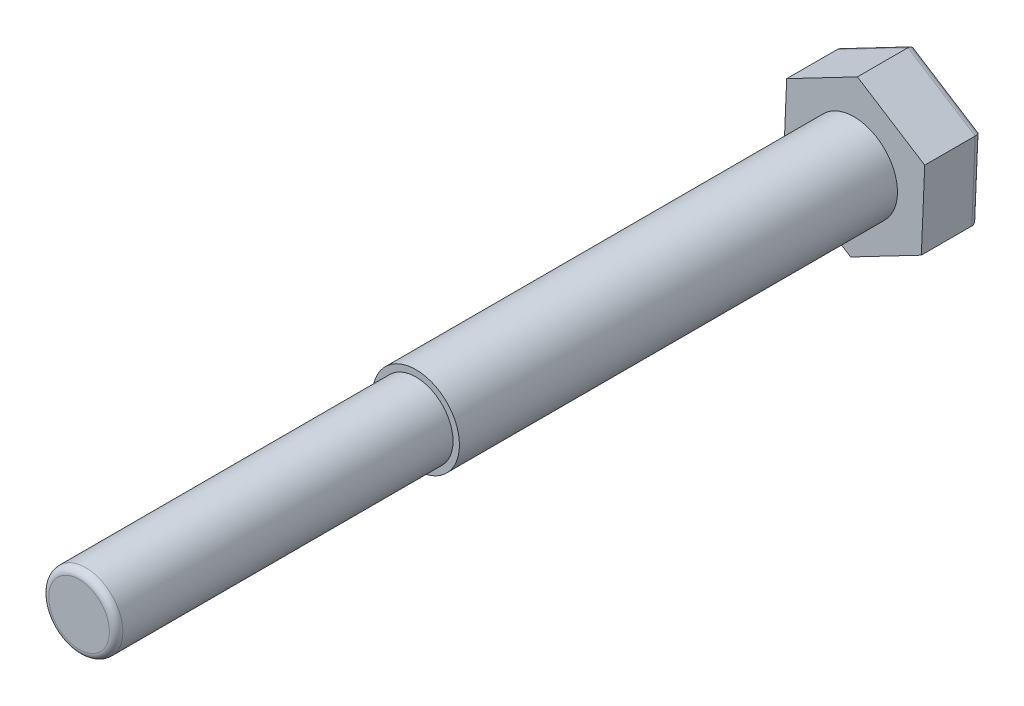
ISO-10303-21;
HEADER;
FILE_DESCRIPTION(('STEP AP214'),'2;1');
FILE_NAME('part.step','',(''),(''),'','','');
FILE_SCHEMA(('AUTOMOTIVE_DESIGN { 1 0 10303 214 1 1 1 1 }'));
ENDSEC;
DATA;
#1=APPLICATION_CONTEXT('core data for automotive mechanical design processes');
#2=APPLICATION_PROTOCOL_DEFINITION('international standard','automotive_design',2000,#1);
#3=PRODUCT_CONTEXT('',#1,'mechanical');
#4=PRODUCT('Part','Part','',(#3));
#5=PRODUCT_RELATED_PRODUCT_CATEGORY('part','',(#4));
#6=PRODUCT_DEFINITION_FORMATION('','',#4);
#7=PRODUCT_DEFINITION_CONTEXT('part definition',#1,'design');
#8=PRODUCT_DEFINITION('design','',#6,#7);
#9=PRODUCT_DEFINITION_SHAPE('','',#8);
#10=(LENGTH_UNIT() NAMED_UNIT(*) SI_UNIT(.MILLI.,.METRE.));
#11=(NAMED_UNIT(*) PLANE_ANGLE_UNIT() SI_UNIT($,.RADIAN.));
#12=(NAMED_UNIT(*) SI_UNIT($,.STERADIAN.) SOLID_ANGLE_UNIT());
#13=UNCERTAINTY_MEASURE_WITH_UNIT(LENGTH_MEASURE(1.E-05),#10,'distance_accuracy_value','');
#14=(GEOMETRIC_REPRESENTATION_CONTEXT(3) GLOBAL_UNCERTAINTY_ASSIGNED_CONTEXT((#13)) GLOBAL_UNIT_ASSIGNED_CONTEXT((#10,
#11,#12)) REPRESENTATION_CONTEXT('',''));
#15=CARTESIAN_POINT('',(0.,0.,0.));
#16=DIRECTION('',(0.,0.,1.));
#17=DIRECTION('',(1.,0.,0.));
#18=AXIS2_PLACEMENT_3D('',#15,#16,#17);
#19=CARTESIAN_POINT('',(0.,0.,147.));
#20=DIRECTION('',(0.,0.,1.));
#21=DIRECTION('',(1.,0.,0.));
#22=AXIS2_PLACEMENT_3D('',#19,#20,#21);
#23=PLANE('',#22);
#24=CARTESIAN_POINT('',(0.,0.,147.));
#25=DIRECTION('',(0.,0.,1.));
#26=DIRECTION('',(1.,0.,0.));
#27=AXIS2_PLACEMENT_3D('',#24,#25,#26);
#28=CIRCLE('',#27,12.9);
#29=CARTESIAN_POINT('',(12.9,0.,147.));
#30=VERTEX_POINT('',#29);
#31=EDGE_CURVE('E130',#30,#30,#28,.T.);
#32=ORIENTED_EDGE('',*,*,#31,.T.);
#33=EDGE_LOOP('',(#32));
#34=FACE_BOUND('',#33,.T.);
#35=CARTESIAN_POINT('',(0.,0.,147.));
#36=DIRECTION('',(0.,0.,1.));
#37=DIRECTION('',(1.,0.,0.));
#38=AXIS2_PLACEMENT_3D('',#35,#36,#37);
#39=CIRCLE('',#38,11.);
#40=CARTESIAN_POINT('',(11.,0.,147.));
#41=VERTEX_POINT('',#40);
#42=EDGE_CURVE('E168',#41,#41,#39,.T.);
#43=ORIENTED_EDGE('',*,*,#42,.F.);
#44=EDGE_LOOP('',(#43));
#45=FACE_BOUND('',#44,.T.);
#46=ADVANCED_FACE('F36',(#34,#45),#23,.T.);
#47=CARTESIAN_POINT('',(18.9733976863162,-36.3457037383633,17.));
#48=DIRECTION('',(0.,0.,-1.));
#49=DIRECTION('',(-1.,0.,0.));
#50=AXIS2_PLACEMENT_3D('',#47,#48,#49);
#51=PLANE('',#50);
#52=DIRECTION('',(0.0424733530909036,0.999097599975706,0.));
#53=VECTOR('',#52,1.);
#54=CARTESIAN_POINT('',(19.9787997617734,-12.6957037383635,17.));
#55=LINE('',#54,#53);
#56=CARTESIAN_POINT('',(19.9787997617734,-12.6957037383635,17.));
#57=VERTEX_POINT('',#56);
#58=CARTESIAN_POINT('',(20.9842018372306,10.9542962616365,17.));
#59=VERTEX_POINT('',#58);
#60=EDGE_CURVE('E122',#57,#59,#55,.T.);
#61=ORIENTED_EDGE('',*,*,#60,.T.);
#62=DIRECTION('',(-0.844007225893572,0.536331802748482,0.));
#63=VECTOR('',#62,1.);
#64=CARTESIAN_POINT('',(20.9842018372306,10.9542962616365,17.));
#65=LINE('',#64,#63);
#66=CARTESIAN_POINT('',(1.0054020754572,23.65,17.));
#67=VERTEX_POINT('',#66);
#68=EDGE_CURVE('E110',#59,#67,#65,.T.);
#69=ORIENTED_EDGE('',*,*,#68,.T.);
#70=DIRECTION('',(-0.886480578984472,-0.462765797227231,0.));
#71=VECTOR('',#70,1.);
#72=CARTESIAN_POINT('',(1.0054020754572,23.65,17.));
#73=LINE('',#72,#71);
#74=CARTESIAN_POINT('',(-19.9787997617736,12.6957037383632,17.));
#75=VERTEX_POINT('',#74);
#76=EDGE_CURVE('E121',#67,#75,#73,.T.);
#77=ORIENTED_EDGE('',*,*,#76,.T.);
#78=DIRECTION('',(-0.0424733530908878,-0.999097599975706,0.));
#79=VECTOR('',#78,1.);
#80=CARTESIAN_POINT('',(-19.9787997617736,12.6957037383632,17.));
#81=LINE('',#80,#79);
#82=CARTESIAN_POINT('',(-20.9842018372304,-10.9542962616368,17.));
#83=VERTEX_POINT('',#82);
#84=EDGE_CURVE('E272',#75,#83,#81,.T.);
#85=ORIENTED_EDGE('',*,*,#84,.T.);
#86=DIRECTION('',(0.844007225893576,-0.536331802748476,0.));
#87=VECTOR('',#86,1.);
#88=CARTESIAN_POINT('',(-20.9842018372304,-10.9542962616368,17.));
#89=LINE('',#88,#87);
#90=CARTESIAN_POINT('',(-1.00540207545719,-23.65,17.));
#91=VERTEX_POINT('',#90);
#92=EDGE_CURVE('E274',#83,#91,#89,.T.);
#93=ORIENTED_EDGE('',*,*,#92,.T.);
#94=DIRECTION('',(0.886480578984476,0.462765797227224,0.));
#95=VECTOR('',#94,1.);
#96=CARTESIAN_POINT('',(-1.00540207545719,-23.65,17.));
#97=LINE('',#96,#95);
#98=EDGE_CURVE('E128',#91,#57,#97,.T.);
#99=ORIENTED_EDGE('',*,*,#98,.T.);
#100=EDGE_LOOP('',(#61,#69,#77,#85,#93,#99));
#101=FACE_BOUND('',#100,.T.);
#102=CARTESIAN_POINT('',(0.,0.,17.));
#103=DIRECTION('',(0.,0.,-1.));
#104=DIRECTION('',(-1.,0.,0.));
#105=AXIS2_PLACEMENT_3D('',#102,#103,#104);
#106=CIRCLE('',#105,12.9);
#107=CARTESIAN_POINT('',(-12.9,0.,17.));
#108=VERTEX_POINT('',#107);
#109=EDGE_CURVE('E135',#108,#108,#106,.F.);
#110=ORIENTED_EDGE('',*,*,#109,.F.);
#111=EDGE_LOOP('',(#110));
#112=FACE_BOUND('',#111,.T.);
#113=ADVANCED_FACE('F125',(#101,#112),#51,.F.);
#114=CARTESIAN_POINT('',(19.9787997617734,-12.6957037383635,17.));
#115=DIRECTION('',(-0.999097599975706,0.0424733530909036,0.));
#116=DIRECTION('',(-0.0424733530909036,-0.999097599975706,0.));
#117=AXIS2_PLACEMENT_3D('',#114,#115,#116);
#118=PLANE('',#117);
#119=DIRECTION('',(0.,0.,-1.));
#120=VECTOR('',#119,1.);
#121=CARTESIAN_POINT('',(19.9787997617734,-12.6957037383635,17.));
#122=LINE('',#121,#120);
#123=CARTESIAN_POINT('',(19.9787997617734,-12.6957037383635,2.));
#124=VERTEX_POINT('',#123);
#125=EDGE_CURVE('E279',#57,#124,#122,.T.);
#126=ORIENTED_EDGE('',*,*,#125,.T.);
#127=DIRECTION('',(0.0424733530909036,0.999097599975706,0.));
#128=VECTOR('',#127,1.);
#129=CARTESIAN_POINT('',(20.9842018372306,10.9542962616365,2.));
#130=LINE('',#129,#128);
#131=CARTESIAN_POINT('',(20.9842018372306,10.9542962616365,2.));
#132=VERTEX_POINT('',#131);
#133=EDGE_CURVE('E134',#124,#132,#130,.T.);
#134=ORIENTED_EDGE('',*,*,#133,.T.);
#135=DIRECTION('',(0.,0.,-1.));
#136=VECTOR('',#135,1.);
#137=CARTESIAN_POINT('',(20.9842018372306,10.9542962616365,17.));
#138=LINE('',#137,#136);
#139=EDGE_CURVE('E115',#59,#132,#138,.T.);
#140=ORIENTED_EDGE('',*,*,#139,.F.);
#141=ORIENTED_EDGE('',*,*,#60,.F.);
#142=EDGE_LOOP('',(#126,#134,#140,#141));
#143=FACE_BOUND('',#142,.T.);
#144=ADVANCED_FACE('F132',(#143),#118,.F.);
#145=CARTESIAN_POINT('',(20.9842018372306,10.9542962616365,17.));
#146=DIRECTION('',(-0.536331802748482,-0.844007225893572,0.));
#147=DIRECTION('',(0.844007225893572,-0.536331802748482,0.));
#148=AXIS2_PLACEMENT_3D('',#145,#146,#147);
#149=PLANE('',#148);
#150=ORIENTED_EDGE('',*,*,#139,.T.);
#151=DIRECTION('',(-0.844007225893572,0.536331802748482,0.));
#152=VECTOR('',#151,1.);
#153=CARTESIAN_POINT('',(1.00540207545719,23.65,2.));
#154=LINE('',#153,#152);
#155=CARTESIAN_POINT('',(1.0054020754572,23.65,2.));
#156=VERTEX_POINT('',#155);
#157=EDGE_CURVE('E138',#132,#156,#154,.T.);
#158=ORIENTED_EDGE('',*,*,#157,.T.);
#159=DIRECTION('',(0.,0.,-1.));
#160=VECTOR('',#159,1.);
#161=CARTESIAN_POINT('',(1.0054020754572,23.65,17.));
#162=LINE('',#161,#160);
#163=EDGE_CURVE('E118',#67,#156,#162,.T.);
#164=ORIENTED_EDGE('',*,*,#163,.F.);
#165=ORIENTED_EDGE('',*,*,#68,.F.);
#166=EDGE_LOOP('',(#150,#158,#164,#165));
#167=FACE_BOUND('',#166,.T.);
#168=ADVANCED_FACE('F112',(#167),#149,.F.);
#169=CARTESIAN_POINT('',(1.0054020754572,23.65,17.));
#170=DIRECTION('',(0.462765797227231,-0.886480578984472,0.));
#171=DIRECTION('',(0.886480578984472,0.462765797227231,0.));
#172=AXIS2_PLACEMENT_3D('',#169,#170,#171);
#173=PLANE('',#172);
#174=ORIENTED_EDGE('',*,*,#163,.T.);
#175=DIRECTION('',(-0.886480578984472,-0.462765797227231,0.));
#176=VECTOR('',#175,1.);
#177=CARTESIAN_POINT('',(-19.9787997617736,12.6957037383632,2.));
#178=LINE('',#177,#176);
#179=CARTESIAN_POINT('',(-19.9787997617736,12.6957037383632,2.));
#180=VERTEX_POINT('',#179);
#181=EDGE_CURVE('E158',#156,#180,#178,.T.);
#182=ORIENTED_EDGE('',*,*,#181,.T.);
#183=DIRECTION('',(0.,0.,-1.));
#184=VECTOR('',#183,1.);
#185=CARTESIAN_POINT('',(-19.9787997617736,12.6957037383632,17.));
#186=LINE('',#185,#184);
#187=EDGE_CURVE('E140',#75,#180,#186,.T.);
#188=ORIENTED_EDGE('',*,*,#187,.F.);
#189=ORIENTED_EDGE('',*,*,#76,.F.);
#190=EDGE_LOOP('',(#174,#182,#188,#189));
#191=FACE_BOUND('',#190,.T.);
#192=ADVANCED_FACE('F223',(#191),#173,.F.);
#193=CARTESIAN_POINT('',(-19.9787997617736,12.6957037383632,17.));
#194=DIRECTION('',(0.999097599975706,-0.0424733530908878,0.));
#195=DIRECTION('',(0.0424733530908878,0.999097599975707,0.));
#196=AXIS2_PLACEMENT_3D('',#193,#194,#195);
#197=PLANE('',#196);
#198=ORIENTED_EDGE('',*,*,#187,.T.);
#199=DIRECTION('',(-0.0424733530908878,-0.999097599975707,0.));
#200=VECTOR('',#199,1.);
#201=CARTESIAN_POINT('',(-20.9842018372304,-10.9542962616368,2.));
#202=LINE('',#201,#200);
#203=CARTESIAN_POINT('',(-20.9842018372304,-10.9542962616368,2.));
#204=VERTEX_POINT('',#203);
#205=EDGE_CURVE('E160',#180,#204,#202,.T.);
#206=ORIENTED_EDGE('',*,*,#205,.T.);
#207=DIRECTION('',(0.,0.,-1.));
#208=VECTOR('',#207,1.);
#209=CARTESIAN_POINT('',(-20.9842018372304,-10.9542962616368,17.));
#210=LINE('',#209,#208);
#211=EDGE_CURVE('E283',#83,#204,#210,.T.);
#212=ORIENTED_EDGE('',*,*,#211,.F.);
#213=ORIENTED_EDGE('',*,*,#84,.F.);
#214=EDGE_LOOP('',(#198,#206,#212,#213));
#215=FACE_BOUND('',#214,.T.);
#216=ADVANCED_FACE('F220',(#215),#197,.F.);
#217=CARTESIAN_POINT('',(-20.9842018372304,-10.9542962616368,17.));
#218=DIRECTION('',(0.536331802748476,0.844007225893576,0.));
#219=DIRECTION('',(-0.844007225893576,0.536331802748476,0.));
#220=AXIS2_PLACEMENT_3D('',#217,#218,#219);
#221=PLANE('',#220);
#222=ORIENTED_EDGE('',*,*,#211,.T.);
#223=DIRECTION('',(0.844007225893576,-0.536331802748476,0.));
#224=VECTOR('',#223,1.);
#225=CARTESIAN_POINT('',(-1.00540207545719,-23.65,2.));
#226=LINE('',#225,#224);
#227=CARTESIAN_POINT('',(-1.00540207545719,-23.65,2.));
#228=VERTEX_POINT('',#227);
#229=EDGE_CURVE('E59',#204,#228,#226,.T.);
#230=ORIENTED_EDGE('',*,*,#229,.T.);
#231=DIRECTION('',(0.,0.,-1.));
#232=VECTOR('',#231,1.);
#233=CARTESIAN_POINT('',(-1.00540207545719,-23.65,17.));
#234=LINE('',#233,#232);
#235=EDGE_CURVE('E281',#91,#228,#234,.T.);
#236=ORIENTED_EDGE('',*,*,#235,.F.);
#237=ORIENTED_EDGE('',*,*,#92,.F.);
#238=EDGE_LOOP('',(#222,#230,#236,#237));
#239=FACE_BOUND('',#238,.T.);
#240=ADVANCED_FACE('F217',(#239),#221,.F.);
#241=CARTESIAN_POINT('',(-1.00540207545719,-23.65,17.));
#242=DIRECTION('',(-0.462765797227224,0.886480578984476,0.));
#243=DIRECTION('',(-0.886480578984476,-0.462765797227224,0.));
#244=AXIS2_PLACEMENT_3D('',#241,#242,#243);
#245=PLANE('',#244);
#246=ORIENTED_EDGE('',*,*,#235,.T.);
#247=DIRECTION('',(0.886480578984476,0.462765797227224,0.));
#248=VECTOR('',#247,1.);
#249=CARTESIAN_POINT('',(19.9787997617734,-12.6957037383635,2.));
#250=LINE('',#249,#248);
#251=EDGE_CURVE('E51',#228,#124,#250,.T.);
#252=ORIENTED_EDGE('',*,*,#251,.T.);
#253=ORIENTED_EDGE('',*,*,#125,.F.);
#254=ORIENTED_EDGE('',*,*,#98,.F.);
#255=EDGE_LOOP('',(#246,#252,#253,#254));
#256=FACE_BOUND('',#255,.T.);
#257=ADVANCED_FACE('F213',(#256),#245,.F.);
#258=CARTESIAN_POINT('',(18.9733976863162,-36.3457037383633,0.));
#259=DIRECTION('',(0.,0.,-1.));
#260=DIRECTION('',(-1.,0.,0.));
#261=AXIS2_PLACEMENT_3D('',#258,#259,#260);
#262=PLANE('',#261);
#263=DIRECTION('',(-0.886480578984472,-0.462765797227231,0.));
#264=VECTOR('',#263,1.);
#265=CARTESIAN_POINT('',(1.93093366991166,21.8770388420311,0.));
#266=LINE('',#265,#264);
#267=CARTESIAN_POINT('',(-18.029648565503,11.4570984955961,0.));
#268=VERTEX_POINT('',#267);
#269=CARTESIAN_POINT('',(0.907314068095531,21.3426829268293,0.));
#270=VERTEX_POINT('',#269);
#271=EDGE_CURVE('E153',#268,#270,#266,.F.);
#272=ORIENTED_EDGE('',*,*,#271,.T.);
#273=DIRECTION('',(-0.844007225893572,0.536331802748482,0.));
#274=VECTOR('',#273,1.);
#275=CARTESIAN_POINT('',(19.9115382317336,9.26628180984933,0.));
#276=LINE('',#275,#274);
#277=CARTESIAN_POINT('',(18.9369626335983,9.88558443123292,0.));
#278=VERTEX_POINT('',#277);
#279=EDGE_CURVE('E155',#270,#278,#276,.F.);
#280=ORIENTED_EDGE('',*,*,#279,.T.);
#281=DIRECTION('',(0.0424733530909036,0.999097599975706,0.));
#282=VECTOR('',#281,1.);
#283=CARTESIAN_POINT('',(17.980604561822,-12.6107570321817,0.));
#284=LINE('',#283,#282);
#285=CARTESIAN_POINT('',(18.0296485655028,-11.4570984955964,0.));
#286=VERTEX_POINT('',#285);
#287=EDGE_CURVE('E145',#278,#286,#284,.F.);
#288=ORIENTED_EDGE('',*,*,#287,.T.);
#289=DIRECTION('',(0.886480578984476,0.462765797227224,0.));
#290=VECTOR('',#289,1.);
#291=CARTESIAN_POINT('',(-1.93093366991164,-21.877038842031,0.));
#292=LINE('',#291,#290);
#293=CARTESIAN_POINT('',(-0.90731406809552,-21.3426829268293,0.));
#294=VERTEX_POINT('',#293);
#295=EDGE_CURVE('E147',#286,#294,#292,.F.);
#296=ORIENTED_EDGE('',*,*,#295,.T.);
#297=DIRECTION('',(0.844007225893576,-0.536331802748476,0.));
#298=VECTOR('',#297,1.);
#299=CARTESIAN_POINT('',(-19.9115382317334,-9.26628180984964,0.));
#300=LINE('',#299,#298);
#301=CARTESIAN_POINT('',(-18.9369626335981,-9.88558443123322,0.));
#302=VERTEX_POINT('',#301);
#303=EDGE_CURVE('E149',#294,#302,#300,.F.);
#304=ORIENTED_EDGE('',*,*,#303,.T.);
#305=DIRECTION('',(-0.0424733530908878,-0.999097599975707,0.));
#306=VECTOR('',#305,1.);
#307=CARTESIAN_POINT('',(-17.9806045618221,12.6107570321814,0.));
#308=LINE('',#307,#306);
#309=EDGE_CURVE('E151',#302,#268,#308,.F.);
#310=ORIENTED_EDGE('',*,*,#309,.T.);
#311=EDGE_LOOP('',(#272,#280,#288,#296,#304,#310));
#312=FACE_BOUND('',#311,.T.);
#313=ADVANCED_FACE('F208',(#312),#262,.T.);
#314=CARTESIAN_POINT('',(0.,0.,147.));
#315=DIRECTION('',(0.,0.,-1.));
#316=DIRECTION('',(-1.,0.,0.));
#317=AXIS2_PLACEMENT_3D('',#314,#315,#316);
#318=CYLINDRICAL_SURFACE('',#317,12.9);
#319=ORIENTED_EDGE('',*,*,#31,.F.);
#320=EDGE_LOOP('',(#319));
#321=FACE_BOUND('',#320,.T.);
#322=ORIENTED_EDGE('',*,*,#109,.T.);
#323=EDGE_LOOP('',(#322));
#324=FACE_BOUND('',#323,.T.);
#325=ADVANCED_FACE('F205',(#321,#324),#318,.T.);
#326=CARTESIAN_POINT('',(-19.9115382317334,-9.26628180984964,2.));
#327=DIRECTION('',(-0.844007225893576,0.536331802748476,0.));
#328=DIRECTION('',(-0.536331802748476,-0.844007225893576,0.));
#329=AXIS2_PLACEMENT_3D('',#326,#327,#328);
#330=CYLINDRICAL_SURFACE('',#329,2.);
#331=CARTESIAN_POINT('',(-18.9369626335981,-9.88558443123322,2.));
#332=DIRECTION('',(-0.462765797227234,0.886480578984471,0.));
#333=DIRECTION('',(-0.886480578984471,-0.462765797227234,0.));
#334=AXIS2_PLACEMENT_3D('',#331,#332,#333);
#335=ELLIPSE('',#334,2.3094010767585,2.);
#336=EDGE_CURVE('E176',#302,#204,#335,.T.);
#337=ORIENTED_EDGE('',*,*,#336,.F.);
#338=ORIENTED_EDGE('',*,*,#303,.F.);
#339=CARTESIAN_POINT('',(-0.90731406809552,-21.3426829268293,2.));
#340=DIRECTION('',(-0.999097599975706,0.0424733530909003,0.));
#341=DIRECTION('',(-0.0424733530909002,-0.999097599975706,0.));
#342=AXIS2_PLACEMENT_3D('',#339,#340,#341);
#343=ELLIPSE('',#342,2.3094010767585,2.);
#344=EDGE_CURVE('E179',#228,#294,#343,.F.);
#345=ORIENTED_EDGE('',*,*,#344,.F.);
#346=ORIENTED_EDGE('',*,*,#229,.F.);
#347=EDGE_LOOP('',(#337,#338,#345,#346));
#348=FACE_BOUND('',#347,.T.);
#349=ADVANCED_FACE('F207',(#348),#330,.T.);
#350=CARTESIAN_POINT('',(-1.93093366991164,-21.877038842031,2.));
#351=DIRECTION('',(-0.886480578984476,-0.462765797227224,0.));
#352=DIRECTION('',(0.462765797227224,-0.886480578984476,0.));
#353=AXIS2_PLACEMENT_3D('',#350,#351,#352);
#354=CYLINDRICAL_SURFACE('',#353,2.);
#355=ORIENTED_EDGE('',*,*,#344,.T.);
#356=ORIENTED_EDGE('',*,*,#295,.F.);
#357=CARTESIAN_POINT('',(18.0296485655028,-11.4570984955964,2.));
#358=DIRECTION('',(-0.536331802748482,-0.844007225893572,0.));
#359=DIRECTION('',(0.844007225893572,-0.536331802748482,0.));
#360=AXIS2_PLACEMENT_3D('',#357,#358,#359);
#361=ELLIPSE('',#360,2.3094010767585,2.);
#362=EDGE_CURVE('E173',#124,#286,#361,.F.);
#363=ORIENTED_EDGE('',*,*,#362,.F.);
#364=ORIENTED_EDGE('',*,*,#251,.F.);
#365=EDGE_LOOP('',(#355,#356,#363,#364));
#366=FACE_BOUND('',#365,.T.);
#367=ADVANCED_FACE('F247',(#366),#354,.T.);
#368=CARTESIAN_POINT('',(-17.9806045618221,12.6107570321814,2.));
#369=DIRECTION('',(0.0424733530908878,0.999097599975707,0.));
#370=DIRECTION('',(-0.999097599975707,0.0424733530908878,0.));
#371=AXIS2_PLACEMENT_3D('',#368,#369,#370);
#372=CYLINDRICAL_SURFACE('',#371,2.);
#373=ORIENTED_EDGE('',*,*,#336,.T.);
#374=ORIENTED_EDGE('',*,*,#205,.F.);
#375=CARTESIAN_POINT('',(-18.029648565503,11.457098495596,2.));
#376=DIRECTION('',(0.536331802748472,0.844007225893579,0.));
#377=DIRECTION('',(-0.844007225893579,0.536331802748472,0.));
#378=AXIS2_PLACEMENT_3D('',#375,#376,#377);
#379=ELLIPSE('',#378,2.30940107675851,2.);
#380=EDGE_CURVE('E170',#268,#180,#379,.T.);
#381=ORIENTED_EDGE('',*,*,#380,.F.);
#382=ORIENTED_EDGE('',*,*,#309,.F.);
#383=EDGE_LOOP('',(#373,#374,#381,#382));
#384=FACE_BOUND('',#383,.T.);
#385=ADVANCED_FACE('F243',(#384),#372,.T.);
#386=CARTESIAN_POINT('',(17.980604561822,-12.6107570321817,2.));
#387=DIRECTION('',(-0.0424733530909036,-0.999097599975706,0.));
#388=DIRECTION('',(0.999097599975706,-0.0424733530909036,0.));
#389=AXIS2_PLACEMENT_3D('',#386,#387,#388);
#390=CYLINDRICAL_SURFACE('',#389,2.);
#391=ORIENTED_EDGE('',*,*,#362,.T.);
#392=ORIENTED_EDGE('',*,*,#287,.F.);
#393=CARTESIAN_POINT('',(18.9369626335983,9.88558443123291,2.));
#394=DIRECTION('',(0.462765797227224,-0.886480578984476,0.));
#395=DIRECTION('',(-0.886480578984476,-0.462765797227224,0.));
#396=AXIS2_PLACEMENT_3D('',#393,#394,#395);
#397=ELLIPSE('',#396,2.3094010767585,2.);
#398=EDGE_CURVE('E167',#132,#278,#397,.F.);
#399=ORIENTED_EDGE('',*,*,#398,.F.);
#400=ORIENTED_EDGE('',*,*,#133,.F.);
#401=EDGE_LOOP('',(#391,#392,#399,#400));
#402=FACE_BOUND('',#401,.T.);
#403=ADVANCED_FACE('F239',(#402),#390,.T.);
#404=CARTESIAN_POINT('',(1.93093366991166,21.8770388420311,2.));
#405=DIRECTION('',(0.886480578984472,0.462765797227231,0.));
#406=DIRECTION('',(-0.462765797227231,0.886480578984472,0.));
#407=AXIS2_PLACEMENT_3D('',#404,#405,#406);
#408=CYLINDRICAL_SURFACE('',#407,2.);
#409=ORIENTED_EDGE('',*,*,#380,.T.);
#410=ORIENTED_EDGE('',*,*,#181,.F.);
#411=CARTESIAN_POINT('',(0.907314068095525,21.3426829268293,2.));
#412=DIRECTION('',(0.999097599975706,-0.0424733530908997,0.));
#413=DIRECTION('',(0.0424733530908995,0.999097599975706,0.));
#414=AXIS2_PLACEMENT_3D('',#411,#412,#413);
#415=ELLIPSE('',#414,2.30940107675851,2.);
#416=EDGE_CURVE('E165',#270,#156,#415,.T.);
#417=ORIENTED_EDGE('',*,*,#416,.F.);
#418=ORIENTED_EDGE('',*,*,#271,.F.);
#419=EDGE_LOOP('',(#409,#410,#417,#418));
#420=FACE_BOUND('',#419,.T.);
#421=ADVANCED_FACE('F235',(#420),#408,.T.);
#422=CARTESIAN_POINT('',(19.9115382317336,9.26628180984933,2.));
#423=DIRECTION('',(0.844007225893572,-0.536331802748482,0.));
#424=DIRECTION('',(0.536331802748482,0.844007225893572,0.));
#425=AXIS2_PLACEMENT_3D('',#422,#423,#424);
#426=CYLINDRICAL_SURFACE('',#425,2.);
#427=ORIENTED_EDGE('',*,*,#398,.T.);
#428=ORIENTED_EDGE('',*,*,#279,.F.);
#429=ORIENTED_EDGE('',*,*,#416,.T.);
#430=ORIENTED_EDGE('',*,*,#157,.F.);
#431=EDGE_LOOP('',(#427,#428,#429,#430));
#432=FACE_BOUND('',#431,.T.);
#433=ADVANCED_FACE('F232',(#432),#426,.T.);
#434=CARTESIAN_POINT('',(0.,0.,247.));
#435=DIRECTION('',(0.,0.,-1.));
#436=DIRECTION('',(-1.,0.,0.));
#437=AXIS2_PLACEMENT_3D('',#434,#435,#436);
#438=CYLINDRICAL_SURFACE('',#437,11.);
#439=CARTESIAN_POINT('',(0.,0.,245.));
#440=DIRECTION('',(0.,0.,1.));
#441=DIRECTION('',(1.,0.,0.));
#442=AXIS2_PLACEMENT_3D('',#439,#440,#441);
#443=CIRCLE('',#442,11.);
#444=CARTESIAN_POINT('',(11.,0.,245.));
#445=VERTEX_POINT('',#444);
#446=EDGE_CURVE('E11',#445,#445,#443,.F.);
#447=ORIENTED_EDGE('',*,*,#446,.T.);
#448=EDGE_LOOP('',(#447));
#449=FACE_BOUND('',#448,.T.);
#450=ORIENTED_EDGE('',*,*,#42,.T.);
#451=EDGE_LOOP('',(#450));
#452=FACE_BOUND('',#451,.T.);
#453=ADVANCED_FACE('F191',(#449,#452),#438,.T.);
#454=CARTESIAN_POINT('',(0.,0.,247.));
#455=DIRECTION('',(0.,0.,1.));
#456=DIRECTION('',(1.,0.,0.));
#457=AXIS2_PLACEMENT_3D('',#454,#455,#456);
#458=PLANE('',#457);
#459=CARTESIAN_POINT('',(0.,0.,247.));
#460=DIRECTION('',(0.,0.,1.));
#461=DIRECTION('',(1.,0.,0.));
#462=AXIS2_PLACEMENT_3D('',#459,#460,#461);
#463=CIRCLE('',#462,9.);
#464=CARTESIAN_POINT('',(9.,0.,247.));
#465=VERTEX_POINT('',#464);
#466=EDGE_CURVE('E44',#465,#465,#463,.T.);
#467=ORIENTED_EDGE('',*,*,#466,.T.);
#468=EDGE_LOOP('',(#467));
#469=FACE_BOUND('',#468,.T.);
#470=ADVANCED_FACE('F184',(#469),#458,.T.);
#471=CARTESIAN_POINT('',(0.,0.,245.));
#472=DIRECTION('',(0.,0.,1.));
#473=DIRECTION('',(1.,0.,0.));
#474=AXIS2_PLACEMENT_3D('',#471,#472,#473);
#475=TOROIDAL_SURFACE('',#474,9.,2.);
#476=ORIENTED_EDGE('',*,*,#446,.F.);
#477=EDGE_LOOP('',(#476));
#478=FACE_BOUND('',#477,.T.);
#479=ORIENTED_EDGE('',*,*,#466,.F.);
#480=EDGE_LOOP('',(#479));
#481=FACE_BOUND('',#480,.T.);
#482=ADVANCED_FACE('F38',(#478,#481),#475,.T.);
#483=CLOSED_SHELL('',(#46,#113,#144,#168,#192,#216,#240,#257,#313,#325,#349,#367,#385,#403,#421,
#433,#453,#470,#482));
#484=MANIFOLD_SOLID_BREP('B2',#483);
#485=ADVANCED_BREP_SHAPE_REPRESENTATION('',(#18,#484),#14);
#486=SHAPE_DEFINITION_REPRESENTATION(#9,#485);
ENDSEC;
END-ISO-10303-21;
